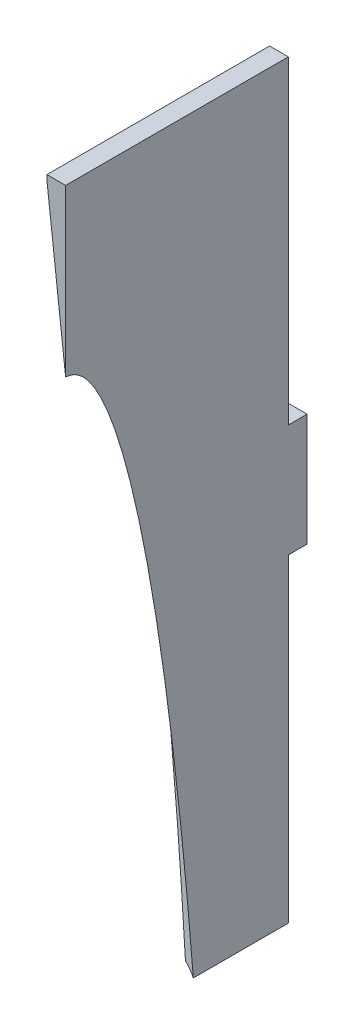
ISO-10303-21;
HEADER;
FILE_DESCRIPTION(('STEP AP214'),'2;1');
FILE_NAME('part.step','',(''),(''),'','','');
FILE_SCHEMA(('AUTOMOTIVE_DESIGN { 1 0 10303 214 1 1 1 1 }'));
ENDSEC;
DATA;
#1=APPLICATION_CONTEXT('core data for automotive mechanical design processes');
#2=APPLICATION_PROTOCOL_DEFINITION('international standard','automotive_design',2000,#1);
#3=PRODUCT_CONTEXT('',#1,'mechanical');
#4=PRODUCT('Part','Part','',(#3));
#5=PRODUCT_RELATED_PRODUCT_CATEGORY('part','',(#4));
#6=PRODUCT_DEFINITION_FORMATION('','',#4);
#7=PRODUCT_DEFINITION_CONTEXT('part definition',#1,'design');
#8=PRODUCT_DEFINITION('design','',#6,#7);
#9=PRODUCT_DEFINITION_SHAPE('','',#8);
#10=(LENGTH_UNIT() NAMED_UNIT(*) SI_UNIT(.MILLI.,.METRE.));
#11=(NAMED_UNIT(*) PLANE_ANGLE_UNIT() SI_UNIT($,.RADIAN.));
#12=(NAMED_UNIT(*) SI_UNIT($,.STERADIAN.) SOLID_ANGLE_UNIT());
#13=UNCERTAINTY_MEASURE_WITH_UNIT(LENGTH_MEASURE(1.E-05),#10,'distance_accuracy_value','');
#14=(GEOMETRIC_REPRESENTATION_CONTEXT(3) GLOBAL_UNCERTAINTY_ASSIGNED_CONTEXT((#13)) GLOBAL_UNIT_ASSIGNED_CONTEXT((#10,
#11,#12)) REPRESENTATION_CONTEXT('',''));
#15=CARTESIAN_POINT('',(0.,0.,0.));
#16=DIRECTION('',(0.,0.,1.));
#17=DIRECTION('',(1.,0.,0.));
#18=AXIS2_PLACEMENT_3D('',#15,#16,#17);
#19=CARTESIAN_POINT('',(0.,31.75,6.14934));
#20=DIRECTION('',(0.,0.,1.));
#21=DIRECTION('',(0.,-1.,0.));
#22=AXIS2_PLACEMENT_3D('',#19,#20,#21);
#23=PLANE('',#22);
#24=DIRECTION('',(0.,-1.,0.));
#25=VECTOR('',#24,1.);
#26=CARTESIAN_POINT('',(0.,31.75,6.14934));
#27=LINE('',#26,#25);
#28=CARTESIAN_POINT('',(0.,31.75,6.14934));
#29=VERTEX_POINT('',#28);
#30=CARTESIAN_POINT('',(0.,31.3395692968414,6.14934000000018));
#31=VERTEX_POINT('',#30);
#32=EDGE_CURVE('E212',#29,#31,#27,.T.);
#33=ORIENTED_EDGE('',*,*,#32,.T.);
#34=DIRECTION('',(-0.115500858174568,0.993307380301253,0.));
#35=VECTOR('',#34,1.);
#36=CARTESIAN_POINT('',(21.9277561136403,-157.239133280458,6.14933999999998));
#37=LINE('',#36,#35);
#38=CARTESIAN_POINT('',(1.58749999999962,17.6870692968485,6.14934000000008));
#39=VERTEX_POINT('',#38);
#40=EDGE_CURVE('E204',#31,#39,#37,.F.);
#41=ORIENTED_EDGE('',*,*,#40,.T.);
#42=DIRECTION('',(0.,-1.,0.));
#43=VECTOR('',#42,1.);
#44=CARTESIAN_POINT('',(1.5875,31.75,6.14934));
#45=LINE('',#44,#43);
#46=CARTESIAN_POINT('',(1.5875,31.75,6.14934));
#47=VERTEX_POINT('',#46);
#48=EDGE_CURVE('E140',#47,#39,#45,.T.);
#49=ORIENTED_EDGE('',*,*,#48,.F.);
#50=DIRECTION('',(1.,0.,0.));
#51=VECTOR('',#50,1.);
#52=CARTESIAN_POINT('',(0.,31.75,6.14934));
#53=LINE('',#52,#51);
#54=EDGE_CURVE('E252',#29,#47,#53,.T.);
#55=ORIENTED_EDGE('',*,*,#54,.F.);
#56=EDGE_LOOP('',(#33,#41,#49,#55));
#57=FACE_BOUND('',#56,.T.);
#58=ADVANCED_FACE('F136',(#57),#23,.T.);
#59=CARTESIAN_POINT('',(1.5875,0.,0.));
#60=DIRECTION('',(-1.,0.,0.));
#61=DIRECTION('',(0.,0.,1.));
#62=AXIS2_PLACEMENT_3D('',#59,#60,#61);
#63=PLANE('',#62);
#64=CARTESIAN_POINT('',(1.5875,-95.5674999999981,6.15052885333518));
#65=DIRECTION('',(-1.,0.,0.));
#66=DIRECTION('',(0.,1.,0.));
#67=AXIS2_PLACEMENT_3D('',#64,#65,#66);
#68=ELLIPSE('',#67,113.254569764576,13.081);
#69=CARTESIAN_POINT('',(1.5875,-31.75,-4.65600961017686));
#70=VERTEX_POINT('',#69);
#71=EDGE_CURVE('E12',#70,#39,#68,.F.);
#72=ORIENTED_EDGE('',*,*,#71,.F.);
#73=DIRECTION('',(0.,0.,-1.));
#74=VECTOR('',#73,1.);
#75=CARTESIAN_POINT('',(1.5875,-31.75,12.7));
#76=LINE('',#75,#74);
#77=CARTESIAN_POINT('',(1.5875,-31.75,-12.7));
#78=VERTEX_POINT('',#77);
#79=EDGE_CURVE('E213',#70,#78,#76,.T.);
#80=ORIENTED_EDGE('',*,*,#79,.T.);
#81=DIRECTION('',(0.,1.,0.));
#82=VECTOR('',#81,1.);
#83=CARTESIAN_POINT('',(1.5875,-31.75,-12.7));
#84=LINE('',#83,#82);
#85=CARTESIAN_POINT('',(1.5875,-4.7625,-12.7));
#86=VERTEX_POINT('',#85);
#87=EDGE_CURVE('E224',#78,#86,#84,.T.);
#88=ORIENTED_EDGE('',*,*,#87,.T.);
#89=DIRECTION('',(0.,0.,-1.));
#90=VECTOR('',#89,1.);
#91=CARTESIAN_POINT('',(1.5875,-4.7625,-12.7));
#92=LINE('',#91,#90);
#93=CARTESIAN_POINT('',(1.5875,-4.7625,-14.2875));
#94=VERTEX_POINT('',#93);
#95=EDGE_CURVE('E222',#86,#94,#92,.T.);
#96=ORIENTED_EDGE('',*,*,#95,.T.);
#97=DIRECTION('',(0.,-1.,0.));
#98=VECTOR('',#97,1.);
#99=CARTESIAN_POINT('',(1.5875,4.7625,-14.2875));
#100=LINE('',#99,#98);
#101=CARTESIAN_POINT('',(1.5875,4.7625,-14.2875));
#102=VERTEX_POINT('',#101);
#103=EDGE_CURVE('E237',#102,#94,#100,.T.);
#104=ORIENTED_EDGE('',*,*,#103,.F.);
#105=DIRECTION('',(0.,0.,-1.));
#106=VECTOR('',#105,1.);
#107=CARTESIAN_POINT('',(1.5875,4.7625,-12.7));
#108=LINE('',#107,#106);
#109=CARTESIAN_POINT('',(1.5875,4.7625,-12.7));
#110=VERTEX_POINT('',#109);
#111=EDGE_CURVE('E232',#110,#102,#108,.T.);
#112=ORIENTED_EDGE('',*,*,#111,.F.);
#113=CARTESIAN_POINT('',(1.5875,31.75,-12.7));
#114=VERTEX_POINT('',#113);
#115=EDGE_CURVE('E220',#110,#114,#84,.T.);
#116=ORIENTED_EDGE('',*,*,#115,.T.);
#117=DIRECTION('',(0.,0.,1.));
#118=VECTOR('',#117,1.);
#119=CARTESIAN_POINT('',(1.5875,31.75,12.7));
#120=LINE('',#119,#118);
#121=EDGE_CURVE('E217',#114,#47,#120,.T.);
#122=ORIENTED_EDGE('',*,*,#121,.T.);
#123=ORIENTED_EDGE('',*,*,#48,.T.);
#124=EDGE_LOOP('',(#72,#80,#88,#96,#104,#112,#116,#122,#123));
#125=FACE_BOUND('',#124,.T.);
#126=ADVANCED_FACE('F138',(#125),#63,.F.);
#127=CARTESIAN_POINT('',(0.,0.,0.));
#128=DIRECTION('',(-1.,0.,0.));
#129=DIRECTION('',(0.,0.,1.));
#130=AXIS2_PLACEMENT_3D('',#127,#128,#129);
#131=PLANE('',#130);
#132=DIRECTION('',(0.,0.,-1.));
#133=VECTOR('',#132,1.);
#134=CARTESIAN_POINT('',(0.,-31.75,12.7));
#135=LINE('',#134,#133);
#136=CARTESIAN_POINT('',(0.,-31.75,-5.57725694845614));
#137=VERTEX_POINT('',#136);
#138=CARTESIAN_POINT('',(0.,-31.75,-12.7));
#139=VERTEX_POINT('',#138);
#140=EDGE_CURVE('E259',#137,#139,#135,.T.);
#141=ORIENTED_EDGE('',*,*,#140,.F.);
#142=CARTESIAN_POINT('',(0.,-81.9149999999986,6.1505288533352));
#143=DIRECTION('',(-1.,0.,0.));
#144=DIRECTION('',(0.,1.,0.));
#145=AXIS2_PLACEMENT_3D('',#142,#143,#144);
#146=ELLIPSE('',#145,113.254569764576,13.081);
#147=EDGE_CURVE('E153',#137,#31,#146,.F.);
#148=ORIENTED_EDGE('',*,*,#147,.T.);
#149=ORIENTED_EDGE('',*,*,#32,.F.);
#150=DIRECTION('',(0.,0.,1.));
#151=VECTOR('',#150,1.);
#152=CARTESIAN_POINT('',(0.,31.75,12.7));
#153=LINE('',#152,#151);
#154=CARTESIAN_POINT('',(0.,31.75,-12.7));
#155=VERTEX_POINT('',#154);
#156=EDGE_CURVE('E261',#155,#29,#153,.T.);
#157=ORIENTED_EDGE('',*,*,#156,.F.);
#158=DIRECTION('',(0.,1.,0.));
#159=VECTOR('',#158,1.);
#160=CARTESIAN_POINT('',(0.,-31.75,-12.7));
#161=LINE('',#160,#159);
#162=CARTESIAN_POINT('',(0.,4.7625,-12.7));
#163=VERTEX_POINT('',#162);
#164=EDGE_CURVE('E260',#163,#155,#161,.T.);
#165=ORIENTED_EDGE('',*,*,#164,.F.);
#166=DIRECTION('',(0.,0.,-1.));
#167=VECTOR('',#166,1.);
#168=CARTESIAN_POINT('',(0.,4.7625,-12.7));
#169=LINE('',#168,#167);
#170=CARTESIAN_POINT('',(0.,4.7625,-14.2875));
#171=VERTEX_POINT('',#170);
#172=EDGE_CURVE('E218',#163,#171,#169,.T.);
#173=ORIENTED_EDGE('',*,*,#172,.T.);
#174=DIRECTION('',(0.,-1.,0.));
#175=VECTOR('',#174,1.);
#176=CARTESIAN_POINT('',(0.,4.7625,-14.2875));
#177=LINE('',#176,#175);
#178=CARTESIAN_POINT('',(0.,-4.7625,-14.2875));
#179=VERTEX_POINT('',#178);
#180=EDGE_CURVE('E250',#171,#179,#177,.T.);
#181=ORIENTED_EDGE('',*,*,#180,.T.);
#182=DIRECTION('',(0.,0.,-1.));
#183=VECTOR('',#182,1.);
#184=CARTESIAN_POINT('',(0.,-4.7625,-12.7));
#185=LINE('',#184,#183);
#186=CARTESIAN_POINT('',(0.,-4.7625,-12.7));
#187=VERTEX_POINT('',#186);
#188=EDGE_CURVE('E233',#187,#179,#185,.T.);
#189=ORIENTED_EDGE('',*,*,#188,.F.);
#190=EDGE_CURVE('E226',#139,#187,#161,.T.);
#191=ORIENTED_EDGE('',*,*,#190,.F.);
#192=EDGE_LOOP('',(#141,#148,#149,#157,#165,#173,#181,#189,#191));
#193=FACE_BOUND('',#192,.T.);
#194=ADVANCED_FACE('F279',(#193),#131,.T.);
#195=CARTESIAN_POINT('',(1.5875,31.75,12.7));
#196=DIRECTION('',(0.,-1.,0.));
#197=DIRECTION('',(0.,0.,-1.));
#198=AXIS2_PLACEMENT_3D('',#195,#196,#197);
#199=PLANE('',#198);
#200=ORIENTED_EDGE('',*,*,#54,.T.);
#201=ORIENTED_EDGE('',*,*,#121,.F.);
#202=DIRECTION('',(-1.,0.,0.));
#203=VECTOR('',#202,1.);
#204=CARTESIAN_POINT('',(1.5875,31.75,-12.7));
#205=LINE('',#204,#203);
#206=EDGE_CURVE('E256',#114,#155,#205,.T.);
#207=ORIENTED_EDGE('',*,*,#206,.T.);
#208=ORIENTED_EDGE('',*,*,#156,.T.);
#209=EDGE_LOOP('',(#200,#201,#207,#208));
#210=FACE_BOUND('',#209,.T.);
#211=ADVANCED_FACE('F288',(#210),#199,.F.);
#212=CARTESIAN_POINT('',(1.5875,-31.75,12.7));
#213=DIRECTION('',(0.,1.,0.));
#214=DIRECTION('',(0.,0.,1.));
#215=AXIS2_PLACEMENT_3D('',#212,#213,#214);
#216=PLANE('',#215);
#217=CARTESIAN_POINT('',(-5.83313953488376,-31.75,6.15052885333525));
#218=DIRECTION('',(0.,1.,0.));
#219=DIRECTION('',(-1.,0.,0.));
#220=AXIS2_PLACEMENT_3D('',#217,#218,#219);
#221=ELLIPSE('',#220,13.1691360191372,13.081);
#222=EDGE_CURVE('E146',#137,#70,#221,.F.);
#223=ORIENTED_EDGE('',*,*,#222,.F.);
#224=ORIENTED_EDGE('',*,*,#140,.T.);
#225=DIRECTION('',(-1.,0.,0.));
#226=VECTOR('',#225,1.);
#227=CARTESIAN_POINT('',(1.5875,-31.75,-12.7));
#228=LINE('',#227,#226);
#229=EDGE_CURVE('E243',#78,#139,#228,.T.);
#230=ORIENTED_EDGE('',*,*,#229,.F.);
#231=ORIENTED_EDGE('',*,*,#79,.F.);
#232=EDGE_LOOP('',(#223,#224,#230,#231));
#233=FACE_BOUND('',#232,.T.);
#234=ADVANCED_FACE('F285',(#233),#216,.F.);
#235=CARTESIAN_POINT('',(1.5875,-31.75,-12.7));
#236=DIRECTION('',(0.,0.,1.));
#237=DIRECTION('',(1.,0.,0.));
#238=AXIS2_PLACEMENT_3D('',#235,#236,#237);
#239=PLANE('',#238);
#240=DIRECTION('',(1.,0.,0.));
#241=VECTOR('',#240,1.);
#242=CARTESIAN_POINT('',(0.,4.7625,-12.7));
#243=LINE('',#242,#241);
#244=EDGE_CURVE('E238',#163,#110,#243,.T.);
#245=ORIENTED_EDGE('',*,*,#244,.F.);
#246=ORIENTED_EDGE('',*,*,#164,.T.);
#247=ORIENTED_EDGE('',*,*,#206,.F.);
#248=ORIENTED_EDGE('',*,*,#115,.F.);
#249=EDGE_LOOP('',(#245,#246,#247,#248));
#250=FACE_BOUND('',#249,.T.);
#251=ADVANCED_FACE('F287',(#250),#239,.F.);
#252=ORIENTED_EDGE('',*,*,#190,.T.);
#253=DIRECTION('',(1.,0.,0.));
#254=VECTOR('',#253,1.);
#255=CARTESIAN_POINT('',(0.,-4.7625,-12.7));
#256=LINE('',#255,#254);
#257=EDGE_CURVE('E240',#187,#86,#256,.T.);
#258=ORIENTED_EDGE('',*,*,#257,.T.);
#259=ORIENTED_EDGE('',*,*,#87,.F.);
#260=ORIENTED_EDGE('',*,*,#229,.T.);
#261=EDGE_LOOP('',(#252,#258,#259,#260));
#262=FACE_BOUND('',#261,.T.);
#263=ADVANCED_FACE('F276',(#262),#239,.F.);
#264=CARTESIAN_POINT('',(0.,-4.7625,-12.7));
#265=DIRECTION('',(0.,-1.,0.));
#266=DIRECTION('',(0.,0.,-1.));
#267=AXIS2_PLACEMENT_3D('',#264,#265,#266);
#268=PLANE('',#267);
#269=ORIENTED_EDGE('',*,*,#95,.F.);
#270=ORIENTED_EDGE('',*,*,#257,.F.);
#271=ORIENTED_EDGE('',*,*,#188,.T.);
#272=DIRECTION('',(1.,0.,0.));
#273=VECTOR('',#272,1.);
#274=CARTESIAN_POINT('',(0.,-4.7625,-14.2875));
#275=LINE('',#274,#273);
#276=EDGE_CURVE('E230',#179,#94,#275,.T.);
#277=ORIENTED_EDGE('',*,*,#276,.T.);
#278=EDGE_LOOP('',(#269,#270,#271,#277));
#279=FACE_BOUND('',#278,.T.);
#280=ADVANCED_FACE('F283',(#279),#268,.T.);
#281=CARTESIAN_POINT('',(0.,4.7625,-12.7));
#282=DIRECTION('',(0.,-1.,0.));
#283=DIRECTION('',(0.,0.,-1.));
#284=AXIS2_PLACEMENT_3D('',#281,#282,#283);
#285=PLANE('',#284);
#286=ORIENTED_EDGE('',*,*,#111,.T.);
#287=DIRECTION('',(1.,0.,0.));
#288=VECTOR('',#287,1.);
#289=CARTESIAN_POINT('',(0.,4.7625,-14.2875));
#290=LINE('',#289,#288);
#291=EDGE_CURVE('E234',#171,#102,#290,.T.);
#292=ORIENTED_EDGE('',*,*,#291,.F.);
#293=ORIENTED_EDGE('',*,*,#172,.F.);
#294=ORIENTED_EDGE('',*,*,#244,.T.);
#295=EDGE_LOOP('',(#286,#292,#293,#294));
#296=FACE_BOUND('',#295,.T.);
#297=ADVANCED_FACE('F306',(#296),#285,.F.);
#298=CARTESIAN_POINT('',(0.,4.7625,-14.2875));
#299=DIRECTION('',(0.,0.,1.));
#300=DIRECTION('',(1.,0.,0.));
#301=AXIS2_PLACEMENT_3D('',#298,#299,#300);
#302=PLANE('',#301);
#303=ORIENTED_EDGE('',*,*,#103,.T.);
#304=ORIENTED_EDGE('',*,*,#276,.F.);
#305=ORIENTED_EDGE('',*,*,#180,.F.);
#306=ORIENTED_EDGE('',*,*,#291,.T.);
#307=EDGE_LOOP('',(#303,#304,#305,#306));
#308=FACE_BOUND('',#307,.T.);
#309=ADVANCED_FACE('F305',(#308),#302,.F.);
#310=CARTESIAN_POINT('',(8.93430232558187,-158.75,6.15052885333511));
#311=DIRECTION('',(-0.115500858174568,0.993307380301253,0.));
#312=DIRECTION('',(-0.993307380301253,-0.115500858174568,0.));
#313=AXIS2_PLACEMENT_3D('',#310,#311,#312);
#314=CYLINDRICAL_SURFACE('',#313,13.081);
#315=ORIENTED_EDGE('',*,*,#222,.T.);
#316=ORIENTED_EDGE('',*,*,#71,.T.);
#317=ORIENTED_EDGE('',*,*,#40,.F.);
#318=ORIENTED_EDGE('',*,*,#147,.F.);
#319=EDGE_LOOP('',(#315,#316,#317,#318));
#320=FACE_BOUND('',#319,.T.);
#321=ADVANCED_FACE('F203',(#320),#314,.F.);
#322=CLOSED_SHELL('',(#58,#126,#194,#211,#234,#251,#263,#280,#297,#309,#321));
#323=MANIFOLD_SOLID_BREP('B2',#322);
#324=ADVANCED_BREP_SHAPE_REPRESENTATION('',(#18,#323),#14);
#325=SHAPE_DEFINITION_REPRESENTATION(#9,#324);
ENDSEC;
END-ISO-10303-21;
